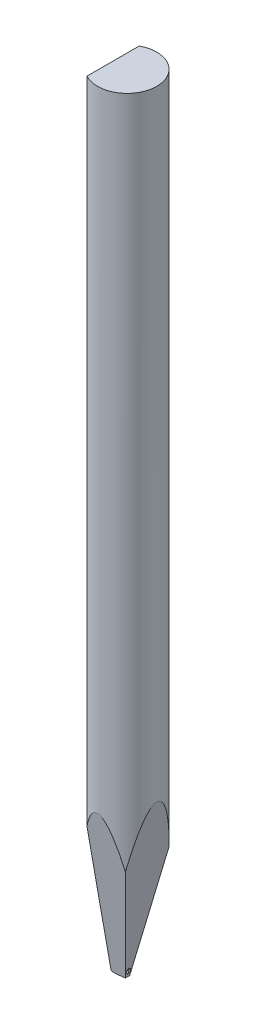
ISO-10303-21;
HEADER;
FILE_DESCRIPTION(('STEP AP214'),'2;1');
FILE_NAME('part.step','',(''),(''),'','','');
FILE_SCHEMA(('AUTOMOTIVE_DESIGN { 1 0 10303 214 1 1 1 1 }'));
ENDSEC;
DATA;
#1=APPLICATION_CONTEXT('core data for automotive mechanical design processes');
#2=APPLICATION_PROTOCOL_DEFINITION('international standard','automotive_design',2000,#1);
#3=PRODUCT_CONTEXT('',#1,'mechanical');
#4=PRODUCT('Part','Part','',(#3));
#5=PRODUCT_RELATED_PRODUCT_CATEGORY('part','',(#4));
#6=PRODUCT_DEFINITION_FORMATION('','',#4);
#7=PRODUCT_DEFINITION_CONTEXT('part definition',#1,'design');
#8=PRODUCT_DEFINITION('design','',#6,#7);
#9=PRODUCT_DEFINITION_SHAPE('','',#8);
#10=(LENGTH_UNIT() NAMED_UNIT(*) SI_UNIT(.MILLI.,.METRE.));
#11=(NAMED_UNIT(*) PLANE_ANGLE_UNIT() SI_UNIT($,.RADIAN.));
#12=(NAMED_UNIT(*) SI_UNIT($,.STERADIAN.) SOLID_ANGLE_UNIT());
#13=UNCERTAINTY_MEASURE_WITH_UNIT(LENGTH_MEASURE(1.E-05),#10,'distance_accuracy_value','');
#14=(GEOMETRIC_REPRESENTATION_CONTEXT(3) GLOBAL_UNCERTAINTY_ASSIGNED_CONTEXT((#13)) GLOBAL_UNIT_ASSIGNED_CONTEXT((#10,
#11,#12)) REPRESENTATION_CONTEXT('',''));
#15=CARTESIAN_POINT('',(0.,0.,0.));
#16=DIRECTION('',(0.,0.,1.));
#17=DIRECTION('',(1.,0.,0.));
#18=AXIS2_PLACEMENT_3D('',#15,#16,#17);
#19=CARTESIAN_POINT('',(26.8738719491216,0.,0.0508));
#20=DIRECTION('',(0.,-0.173648177666931,0.984807753012208));
#21=DIRECTION('',(0.,-0.984807753012208,-0.173648177666931));
#22=AXIS2_PLACEMENT_3D('',#19,#20,#21);
#23=PLANE('',#22);
#24=CARTESIAN_POINT('',(-0.34798,0.02794,0.0557265758409954));
#25=DIRECTION('',(0.,-0.173648177666931,0.984807753012208));
#26=DIRECTION('',(0.,-0.984807753012208,-0.173648177666931));
#27=AXIS2_PLACEMENT_3D('',#24,#25,#26);
#28=ELLIPSE('',#27,0.0283710195360877,0.02794);
#29=CARTESIAN_POINT('',(-0.34798,0.,0.0508000000000009));
#30=VERTEX_POINT('',#29);
#31=CARTESIAN_POINT('',(-0.37592,0.02794,0.0557265758409954));
#32=VERTEX_POINT('',#31);
#33=EDGE_CURVE('E216',#30,#32,#28,.F.);
#34=ORIENTED_EDGE('',*,*,#33,.F.);
#35=DIRECTION('',(-1.,0.,0.));
#36=VECTOR('',#35,1.);
#37=CARTESIAN_POINT('',(26.8738719491216,0.,0.0508));
#38=LINE('',#37,#36);
#39=CARTESIAN_POINT('',(-0.236219999999995,0.,0.0508));
#40=VERTEX_POINT('',#39);
#41=EDGE_CURVE('E287',#40,#30,#38,.T.);
#42=ORIENTED_EDGE('',*,*,#41,.F.);
#43=DIRECTION('',(-0.98997002855162,-0.139131214142995,-0.0245325869121374));
#44=VECTOR('',#43,1.);
#45=CARTESIAN_POINT('',(26.3327723368183,3.73402836021789,0.709209946637006));
#46=LINE('',#45,#44);
#47=CARTESIAN_POINT('',(0.0112116383295108,0.0347742489826093,0.0569316383295079));
#48=VERTEX_POINT('',#47);
#49=EDGE_CURVE('E284',#48,#40,#46,.T.);
#50=ORIENTED_EDGE('',*,*,#49,.F.);
#51=DIRECTION('',(-0.171087869746036,-0.970287525247814,-0.171087869746036));
#52=VECTOR('',#51,1.);
#53=CARTESIAN_POINT('',(0.791557999082992,4.46033837772866,0.837277999082991));
#54=LINE('',#53,#52);
#55=CARTESIAN_POINT('',(0.537041505266774,3.0169036135559,0.582761505266773));
#56=VERTEX_POINT('',#55);
#57=EDGE_CURVE('E281',#56,#48,#54,.T.);
#58=ORIENTED_EDGE('',*,*,#57,.F.);
#59=CARTESIAN_POINT('',(0.,-0.288101116436578,0.));
#60=DIRECTION('',(0.,-0.173648177666931,0.984807753012208));
#61=DIRECTION('',(0.,-0.984807753012208,-0.173648177666931));
#62=AXIS2_PLACEMENT_3D('',#59,#60,#61);
#63=ELLIPSE('',#62,4.56371043248163,0.792479999999998);
#64=CARTESIAN_POINT('',(-0.37592,3.66844093071415,0.69764511322018));
#65=VERTEX_POINT('',#64);
#66=EDGE_CURVE('E292',#56,#65,#63,.T.);
#67=ORIENTED_EDGE('',*,*,#66,.T.);
#68=DIRECTION('',(0.,0.984807753012208,0.173648177666931));
#69=VECTOR('',#68,1.);
#70=CARTESIAN_POINT('',(-0.37592,20.251112252608,3.62161747949059));
#71=LINE('',#70,#69);
#72=EDGE_CURVE('E306',#32,#65,#71,.T.);
#73=ORIENTED_EDGE('',*,*,#72,.F.);
#74=EDGE_LOOP('',(#34,#42,#50,#58,#67,#73));
#75=FACE_BOUND('',#74,.T.);
#76=ADVANCED_FACE('F46',(#75),#23,.T.);
#77=CARTESIAN_POINT('',(26.8738719491216,0.,-0.0508));
#78=DIRECTION('',(0.,-0.173648177666931,-0.984807753012208));
#79=DIRECTION('',(0.,0.984807753012208,-0.173648177666931));
#80=AXIS2_PLACEMENT_3D('',#77,#78,#79);
#81=PLANE('',#80);
#82=CARTESIAN_POINT('',(-0.34798,0.02794,-0.0557265758409919));
#83=DIRECTION('',(0.,-0.173648177666931,-0.984807753012208));
#84=DIRECTION('',(0.,0.984807753012208,-0.173648177666931));
#85=AXIS2_PLACEMENT_3D('',#82,#83,#84);
#86=ELLIPSE('',#85,0.0283710195360877,0.02794);
#87=CARTESIAN_POINT('',(-0.37592,0.02794,-0.0557265758409919));
#88=VERTEX_POINT('',#87);
#89=CARTESIAN_POINT('',(-0.34798,0.,-0.0507999999999974));
#90=VERTEX_POINT('',#89);
#91=EDGE_CURVE('E213',#88,#90,#86,.F.);
#92=ORIENTED_EDGE('',*,*,#91,.F.);
#93=DIRECTION('',(0.,-0.984807753012208,0.173648177666931));
#94=VECTOR('',#93,1.);
#95=CARTESIAN_POINT('',(-0.37592,20.5255765703836,-3.67001294395617));
#96=LINE('',#95,#94);
#97=CARTESIAN_POINT('',(-0.37592,3.66844093071414,-0.69764511322018));
#98=VERTEX_POINT('',#97);
#99=EDGE_CURVE('E205',#98,#88,#96,.T.);
#100=ORIENTED_EDGE('',*,*,#99,.F.);
#101=CARTESIAN_POINT('',(0.,-0.288101116436578,0.));
#102=DIRECTION('',(0.,-0.173648177666931,-0.984807753012208));
#103=DIRECTION('',(0.,-0.984807753012208,0.173648177666931));
#104=AXIS2_PLACEMENT_3D('',#101,#102,#103);
#105=ELLIPSE('',#104,4.56371043248163,0.792479999999998);
#106=CARTESIAN_POINT('',(0.537041505266774,3.0169036135559,-0.582761505266773));
#107=VERTEX_POINT('',#106);
#108=EDGE_CURVE('E295',#98,#107,#105,.T.);
#109=ORIENTED_EDGE('',*,*,#108,.T.);
#110=DIRECTION('',(0.171087869746036,0.970287525247814,-0.171087869746036));
#111=VECTOR('',#110,1.);
#112=CARTESIAN_POINT('',(0.791557999082992,4.46033837772866,-0.837277999082991));
#113=LINE('',#112,#111);
#114=CARTESIAN_POINT('',(0.0112116383295108,0.0347742489826093,-0.0569316383295079));
#115=VERTEX_POINT('',#114);
#116=EDGE_CURVE('E309',#115,#107,#113,.T.);
#117=ORIENTED_EDGE('',*,*,#116,.F.);
#118=DIRECTION('',(0.98997002855162,0.139131214142995,-0.0245325869121374));
#119=VECTOR('',#118,1.);
#120=CARTESIAN_POINT('',(26.3327723368183,3.73402836021789,-0.709209946637006));
#121=LINE('',#120,#119);
#122=CARTESIAN_POINT('',(-0.236219999999995,0.,-0.0508));
#123=VERTEX_POINT('',#122);
#124=EDGE_CURVE('E312',#123,#115,#121,.T.);
#125=ORIENTED_EDGE('',*,*,#124,.F.);
#126=DIRECTION('',(-1.,0.,0.));
#127=VECTOR('',#126,1.);
#128=CARTESIAN_POINT('',(26.8738719491216,0.,-0.0508));
#129=LINE('',#128,#127);
#130=EDGE_CURVE('E289',#123,#90,#129,.T.);
#131=ORIENTED_EDGE('',*,*,#130,.T.);
#132=EDGE_LOOP('',(#92,#100,#109,#117,#125,#131));
#133=FACE_BOUND('',#132,.T.);
#134=ADVANCED_FACE('F401',(#133),#81,.T.);
#135=CARTESIAN_POINT('',(-0.23622,0.,27.2760283406468));
#136=DIRECTION('',(-0.139173100960066,0.99026806874157,0.));
#137=DIRECTION('',(-0.99026806874157,-0.139173100960066,0.));
#138=AXIS2_PLACEMENT_3D('',#135,#136,#137);
#139=PLANE('',#138);
#140=DIRECTION('',(-0.99026806874157,-0.139173100960066,0.));
#141=VECTOR('',#140,1.);
#142=CARTESIAN_POINT('',(-0.23622,0.,0.0304799999999994));
#143=LINE('',#142,#141);
#144=CARTESIAN_POINT('',(-0.10414,0.0185626334474919,0.0304799999999997));
#145=VERTEX_POINT('',#144);
#146=CARTESIAN_POINT('',(-0.219891220242702,0.00229486033676197,0.03048));
#147=VERTEX_POINT('',#146);
#148=EDGE_CURVE('E267',#145,#147,#143,.T.);
#149=ORIENTED_EDGE('',*,*,#148,.F.);
#150=DIRECTION('',(0.,0.,1.));
#151=VECTOR('',#150,1.);
#152=CARTESIAN_POINT('',(-0.10414,0.0185626334474919,27.2760283406468));
#153=LINE('',#152,#151);
#154=CARTESIAN_POINT('',(-0.10414,0.0185626334474919,-0.0304799999999997));
#155=VERTEX_POINT('',#154);
#156=EDGE_CURVE('E323',#155,#145,#153,.T.);
#157=ORIENTED_EDGE('',*,*,#156,.F.);
#158=DIRECTION('',(-0.99026806874157,-0.139173100960066,0.));
#159=VECTOR('',#158,1.);
#160=CARTESIAN_POINT('',(-0.23622,0.,-0.0304799999999994));
#161=LINE('',#160,#159);
#162=CARTESIAN_POINT('',(-0.219891220242702,0.00229486033676197,-0.03048));
#163=VERTEX_POINT('',#162);
#164=EDGE_CURVE('E263',#155,#163,#161,.T.);
#165=ORIENTED_EDGE('',*,*,#164,.T.);
#166=CARTESIAN_POINT('',(-2.39594817183527,-0.30353,0.));
#167=DIRECTION('',(-0.139173100960066,0.99026806874157,0.));
#168=DIRECTION('',(-0.99026806874157,-0.139173100960066,0.));
#169=AXIS2_PLACEMENT_3D('',#166,#167,#168);
#170=ELLIPSE('',#169,2.20832903686027,0.30734);
#171=CARTESIAN_POINT('',(-0.23622,0.,-0.0482432865795759));
#172=VERTEX_POINT('',#171);
#173=EDGE_CURVE('E315',#163,#172,#170,.T.);
#174=ORIENTED_EDGE('',*,*,#173,.T.);
#175=DIRECTION('',(0.,0.,-1.));
#176=VECTOR('',#175,1.);
#177=CARTESIAN_POINT('',(-0.23622,0.,27.2760283406468));
#178=LINE('',#177,#176);
#179=EDGE_CURVE('E273',#172,#123,#178,.T.);
#180=ORIENTED_EDGE('',*,*,#179,.T.);
#181=ORIENTED_EDGE('',*,*,#124,.T.);
#182=DIRECTION('',(0.,0.,-1.));
#183=VECTOR('',#182,1.);
#184=CARTESIAN_POINT('',(0.0112116383295079,0.0347742489826094,27.2760283406468));
#185=LINE('',#184,#183);
#186=EDGE_CURVE('E270',#48,#115,#185,.T.);
#187=ORIENTED_EDGE('',*,*,#186,.F.);
#188=ORIENTED_EDGE('',*,*,#49,.T.);
#189=CARTESIAN_POINT('',(-0.236219999999999,0.,0.0482432865795852));
#190=VERTEX_POINT('',#189);
#191=EDGE_CURVE('E275',#40,#190,#178,.T.);
#192=ORIENTED_EDGE('',*,*,#191,.T.);
#193=EDGE_CURVE('E316',#190,#147,#170,.T.);
#194=ORIENTED_EDGE('',*,*,#193,.T.);
#195=EDGE_LOOP('',(#149,#157,#165,#174,#180,#181,#187,#188,#192,#194));
#196=FACE_BOUND('',#195,.T.);
#197=ADVANCED_FACE('F348',(#196),#139,.F.);
#198=CARTESIAN_POINT('',(26.6992469491216,-0.30353,0.));
#199=DIRECTION('',(-1.,0.,0.));
#200=DIRECTION('',(0.,0.,1.));
#201=AXIS2_PLACEMENT_3D('',#198,#199,#200);
#202=CYLINDRICAL_SURFACE('',#201,0.30734);
#203=DIRECTION('',(-1.,0.,0.));
#204=VECTOR('',#203,1.);
#205=CARTESIAN_POINT('',(26.6992469491216,0.,0.0482432865795852));
#206=LINE('',#205,#204);
#207=CARTESIAN_POINT('',(-0.347980000000001,0.,0.0482432865795858));
#208=VERTEX_POINT('',#207);
#209=EDGE_CURVE('E322',#190,#208,#206,.T.);
#210=ORIENTED_EDGE('',*,*,#209,.T.);
#211=CARTESIAN_POINT('',(-0.34798,0.,0.0482432865795852));
#212=CARTESIAN_POINT('',(-0.348252296644925,-1.31195659384749E-07,0.0482440492475039));
#213=CARTESIAN_POINT('',(-0.348523545505448,3.97529791394988E-06,0.0482182784555705));
#214=CARTESIAN_POINT('',(-0.349054083948038,1.94428443583289E-05,0.0481208402416169));
#215=CARTESIAN_POINT('',(-0.349313481002626,3.07120542223338E-05,0.0480497538396694));
#216=CARTESIAN_POINT('',(-0.349886743277128,6.32629122701802E-05,0.0478436938858755));
#217=CARTESIAN_POINT('',(-0.350196039020314,8.64427631084383E-05,0.0476965466679436));
#218=CARTESIAN_POINT('',(-0.350788027579429,0.000139867694047395,0.0473552263029247));
#219=CARTESIAN_POINT('',(-0.351070565232969,0.000170150815958249,0.0471607997362597));
#220=CARTESIAN_POINT('',(-0.351797678633356,0.000258175405523862,0.0465912997969798));
#221=CARTESIAN_POINT('',(-0.352217043441584,0.000320286556949055,0.0461851188543542));
#222=CARTESIAN_POINT('',(-0.352993403074285,0.000450697484912939,0.045318964518081));
#223=CARTESIAN_POINT('',(-0.353350255395906,0.0005190108757752,0.0448588721094139));
#224=CARTESIAN_POINT('',(-0.354623695048138,0.000783914898953172,0.0430431737934963));
#225=CARTESIAN_POINT('',(-0.355379822665012,0.00098815447895486,0.0415787296435384));
#226=CARTESIAN_POINT('',(-0.356692318863868,0.0013850917833933,0.038562532067988));
#227=CARTESIAN_POINT('',(-0.357247387378443,0.00157770790674325,0.0370102829147653));
#228=CARTESIAN_POINT('',(-0.359321149792044,0.0023456206793924,0.0303893376374603));
#229=CARTESIAN_POINT('',(-0.360257770424908,0.00282567245131376,0.0251321497342822));
#230=CARTESIAN_POINT('',(-0.361551936903057,0.00351278341625745,0.014539520375778));
#231=CARTESIAN_POINT('',(-0.361907066355234,0.00371870279026332,0.00920384488122757));
#232=CARTESIAN_POINT('',(-0.362154217543677,0.0038612004814519,-0.00215201122800966));
#233=CARTESIAN_POINT('',(-0.361982628750261,0.00376079301183627,-0.00817418080146167));
#234=CARTESIAN_POINT('',(-0.360999130647652,0.00320709071523554,-0.0201325235406135));
#235=CARTESIAN_POINT('',(-0.360191991906012,0.00275642532114498,-0.0260690031870829));
#236=CARTESIAN_POINT('',(-0.358232095740427,0.001944655358155,-0.0338747550375601));
#237=CARTESIAN_POINT('',(-0.357637288229639,0.00171300123613475,-0.0358996292027306));
#238=CARTESIAN_POINT('',(-0.356122323252021,0.00119745877491824,-0.0400446770350524));
#239=CARTESIAN_POINT('',(-0.355178593442109,0.000910792082540283,-0.0421580801913151));
#240=CARTESIAN_POINT('',(-0.353655530246412,0.000581526564032731,-0.0444320817022823));
#241=CARTESIAN_POINT('',(-0.353393651448074,0.000528075963328786,-0.0447961119259361));
#242=CARTESIAN_POINT('',(-0.352835779504986,0.000423669016665647,-0.045499072621403));
#243=CARTESIAN_POINT('',(-0.352539718401944,0.00037271793670273,-0.0458379508131751));
#244=CARTESIAN_POINT('',(-0.351903397718423,0.000274943891731922,-0.0464816039815951));
#245=CARTESIAN_POINT('',(-0.351562622422041,0.000228181889394723,-0.0467858886873818));
#246=CARTESIAN_POINT('',(-0.350832796873585,0.000143622369928017,-0.0473316207810331));
#247=CARTESIAN_POINT('',(-0.350443957507317,0.000105787671713089,-0.0475733292155792));
#248=CARTESIAN_POINT('',(-0.34978718459901,5.74282979152137E-05,-0.0478807134545133));
#249=CARTESIAN_POINT('',(-0.349534511485235,4.20567642306474E-05,-0.0479779895919411));
#250=CARTESIAN_POINT('',(-0.349016605835852,1.80496782489349E-05,-0.0481296519413833));
#251=CARTESIAN_POINT('',(-0.348751411991796,9.39465253077176E-06,-0.0481841621513262));
#252=CARTESIAN_POINT('',(-0.348316427274345,1.50783539036545E-06,-0.048233796094123));
#253=CARTESIAN_POINT('',(-0.348148240178769,-4.30094660196576E-08,-0.0482435397422961));
#254=CARTESIAN_POINT('',(-0.34798,0.,-0.0482432865795859));
#255=B_SPLINE_CURVE_WITH_KNOTS('',3,(#211,#212,#213,#214,#215,#216,#217,#218,#219,#220,#221,
#222,#223,#224,#225,#226,#227,#228,#229,#230,#231,#232,#233,#234,#235,#236,#237,#238,#239,#240,
#241,#242,#243,#244,#245,#246,#247,#248,#249,#250,#251,#252,#253,#254),.UNSPECIFIED.,.F.,.F.,(4,
2,2,2,2,2,2,2,2,2,2,2,2,2,2,2,2,2,2,2,2,4),(0.,0.000813951897065788,0.00161767193750738,
0.00264178770559886,0.00367151870355399,0.00542291670139487,0.00717825663544555,
0.0121215106148599,0.0170961804313095,0.0330671249043096,0.0491042699221511,0.0671510890543338,
0.0850637216864271,0.0914325778752907,0.0983489113876423,0.0997021906160121,0.101058208212651,
0.102431526643176,0.103799020226141,0.104609536963543,0.10541769486763,0.105922115585613),.UNSPECIFIED.);
#256=CARTESIAN_POINT('',(-0.359869384762639,0.00266441680316907,0.0265067437956558));
#257=VERTEX_POINT('',#256);
#258=EDGE_CURVE('E214',#208,#257,#255,.T.);
#259=ORIENTED_EDGE('',*,*,#258,.T.);
#260=CARTESIAN_POINT('',(-0.37592,0.,-0.0482432865795854));
#261=CARTESIAN_POINT('',(-0.363217772431748,0.00253447256157342,-0.0322972656685655));
#262=CARTESIAN_POINT('',(-0.35052,0.00380999999999999,-0.0161478491107738));
#263=CARTESIAN_POINT('',(-0.35052,0.00380999999999997,0.0161478491107741));
#264=CARTESIAN_POINT('',(-0.363217772431748,0.00253447256157349,0.0322972656685651));
#265=CARTESIAN_POINT('',(-0.37592,0.,0.0482432865795852));
#266=(BOUNDED_CURVE() B_SPLINE_CURVE(3,(#260,#261,#262,#263,#264,#265),.UNSPECIFIED.,.F.,
.F.) B_SPLINE_CURVE_WITH_KNOTS((4,2,4),(1.41317404265068,1.5707963267949,1.72841861093912),
.UNSPECIFIED.) CURVE() GEOMETRIC_REPRESENTATION_ITEM() RATIONAL_B_SPLINE_CURVE((1.,1.,1.,1.,1.,1.)) REPRESENTATION_ITEM(''));
#267=CARTESIAN_POINT('',(-0.359869345133111,0.00266441457640248,-0.026506769547461));
#268=VERTEX_POINT('',#267);
#269=EDGE_CURVE('E197',#257,#268,#266,.F.);
#270=ORIENTED_EDGE('',*,*,#269,.T.);
#271=CARTESIAN_POINT('',(-0.347980000000001,0.,-0.0482432865795858));
#272=VERTEX_POINT('',#271);
#273=EDGE_CURVE('E79',#268,#272,#255,.T.);
#274=ORIENTED_EDGE('',*,*,#273,.T.);
#275=DIRECTION('',(-1.,0.,0.));
#276=VECTOR('',#275,1.);
#277=CARTESIAN_POINT('',(26.6992469491216,0.,-0.0482432865795852));
#278=LINE('',#277,#276);
#279=EDGE_CURVE('E274',#172,#272,#278,.T.);
#280=ORIENTED_EDGE('',*,*,#279,.F.);
#281=ORIENTED_EDGE('',*,*,#173,.F.);
#282=DIRECTION('',(-1.,0.,0.));
#283=VECTOR('',#282,1.);
#284=CARTESIAN_POINT('',(26.6992469491216,0.00229486033676197,-0.03048));
#285=LINE('',#284,#283);
#286=CARTESIAN_POINT('',(-0.250499789357019,0.00229486033676168,-0.03048));
#287=VERTEX_POINT('',#286);
#288=EDGE_CURVE('E319',#163,#287,#285,.T.);
#289=ORIENTED_EDGE('',*,*,#288,.T.);
#290=CARTESIAN_POINT('',(-0.250499789357019,0.002294860336762,0.03048));
#291=CARTESIAN_POINT('',(-0.259076938263125,0.00172519583332262,0.0361957994489226));
#292=CARTESIAN_POINT('',(-0.271209651741863,0.00171565237775058,0.0362982767150302));
#293=CARTESIAN_POINT('',(-0.291802330840911,0.00288099375836612,0.0245921957541284));
#294=CARTESIAN_POINT('',(-0.299524052155455,0.00381566011554372,0.0124973879925436));
#295=CARTESIAN_POINT('',(-0.299445507311918,0.00380427753482841,-0.0127742455996653));
#296=CARTESIAN_POINT('',(-0.291682746457828,0.00286585524756007,-0.0247675498216622));
#297=CARTESIAN_POINT('',(-0.271072903155547,0.00170638974053564,-0.0363675406814372));
#298=CARTESIAN_POINT('',(-0.259039156501342,0.00172700889941999,-0.036177607825366));
#299=CARTESIAN_POINT('',(-0.250499789357018,0.00229486033676202,-0.03048));
#300=(BOUNDED_CURVE() B_SPLINE_CURVE(3,(#290,#291,#292,#293,#294,#295,#296,#297,#298,#299),
.UNSPECIFIED.,.F.,.F.) B_SPLINE_CURVE_WITH_KNOTS((4,2,2,2,4),(0.,2.5360657926676E-05,
5.07213158533513E-05,7.60819737800265E-05,0.000101442631706702),
.UNSPECIFIED.) CURVE() GEOMETRIC_REPRESENTATION_ITEM() RATIONAL_B_SPLINE_CURVE((1.,1.,1.,1.,1.,
1.,1.,1.,1.,1.)) REPRESENTATION_ITEM(''));
#301=CARTESIAN_POINT('',(-0.250499789357018,0.00229486033676188,0.03048));
#302=VERTEX_POINT('',#301);
#303=EDGE_CURVE('E325',#287,#302,#300,.F.);
#304=ORIENTED_EDGE('',*,*,#303,.T.);
#305=DIRECTION('',(-1.,0.,0.));
#306=VECTOR('',#305,1.);
#307=CARTESIAN_POINT('',(26.6992469491216,0.00229486033676197,0.03048));
#308=LINE('',#307,#306);
#309=EDGE_CURVE('E326',#147,#302,#308,.T.);
#310=ORIENTED_EDGE('',*,*,#309,.F.);
#311=ORIENTED_EDGE('',*,*,#193,.F.);
#312=EDGE_LOOP('',(#210,#259,#270,#274,#280,#281,#289,#304,#310,#311));
#313=FACE_BOUND('',#312,.T.);
#314=ADVANCED_FACE('F337',(#313),#202,.F.);
#315=CARTESIAN_POINT('',(0.,0.,0.));
#316=DIRECTION('',(0.,1.,0.));
#317=DIRECTION('',(0.,0.,1.));
#318=AXIS2_PLACEMENT_3D('',#315,#316,#317);
#319=PLANE('',#318);
#320=ORIENTED_EDGE('',*,*,#41,.T.);
#321=DIRECTION('',(0.,0.,-1.));
#322=VECTOR('',#321,1.);
#323=CARTESIAN_POINT('',(-0.34798,0.,26.4486411070088));
#324=LINE('',#323,#322);
#325=EDGE_CURVE('E71',#30,#208,#324,.T.);
#326=ORIENTED_EDGE('',*,*,#325,.T.);
#327=ORIENTED_EDGE('',*,*,#209,.F.);
#328=ORIENTED_EDGE('',*,*,#191,.F.);
#329=EDGE_LOOP('',(#320,#326,#327,#328));
#330=FACE_BOUND('',#329,.T.);
#331=ADVANCED_FACE('F347',(#330),#319,.F.);
#332=ORIENTED_EDGE('',*,*,#279,.T.);
#333=EDGE_CURVE('E212',#272,#90,#324,.T.);
#334=ORIENTED_EDGE('',*,*,#333,.T.);
#335=ORIENTED_EDGE('',*,*,#130,.F.);
#336=ORIENTED_EDGE('',*,*,#179,.F.);
#337=EDGE_LOOP('',(#332,#334,#335,#336));
#338=FACE_BOUND('',#337,.T.);
#339=ADVANCED_FACE('F406',(#338),#319,.F.);
#340=CARTESIAN_POINT('',(0.,21.0312,0.));
#341=DIRECTION('',(0.,-1.,0.));
#342=DIRECTION('',(0.,0.,-1.));
#343=AXIS2_PLACEMENT_3D('',#340,#341,#342);
#344=CYLINDRICAL_SURFACE('',#343,0.792479999999998);
#345=ORIENTED_EDGE('',*,*,#66,.F.);
#346=CARTESIAN_POINT('',(0.,-0.0288101116436568,0.));
#347=DIRECTION('',(-0.984807753012208,0.173648177666931,0.));
#348=DIRECTION('',(-0.173648177666931,-0.984807753012208,0.));
#349=AXIS2_PLACEMENT_3D('',#346,#347,#348);
#350=ELLIPSE('',#349,4.56371043248164,0.792479999999998);
#351=EDGE_CURVE('E278',#56,#107,#350,.T.);
#352=ORIENTED_EDGE('',*,*,#351,.T.);
#353=ORIENTED_EDGE('',*,*,#108,.F.);
#354=DIRECTION('',(0.,-1.,0.));
#355=VECTOR('',#354,1.);
#356=CARTESIAN_POINT('',(-0.37592,21.0312,-0.69764511322018));
#357=LINE('',#356,#355);
#358=CARTESIAN_POINT('',(-0.37592,21.0312,-0.69764511322018));
#359=VERTEX_POINT('',#358);
#360=EDGE_CURVE('E301',#359,#98,#357,.T.);
#361=ORIENTED_EDGE('',*,*,#360,.F.);
#362=CARTESIAN_POINT('',(0.,21.0312,0.));
#363=DIRECTION('',(0.,1.,0.));
#364=DIRECTION('',(0.,0.,1.));
#365=AXIS2_PLACEMENT_3D('',#362,#363,#364);
#366=CIRCLE('',#365,0.792479999999998);
#367=CARTESIAN_POINT('',(-0.37592,21.0312,0.69764511322018));
#368=VERTEX_POINT('',#367);
#369=EDGE_CURVE('E303',#368,#359,#366,.T.);
#370=ORIENTED_EDGE('',*,*,#369,.F.);
#371=DIRECTION('',(0.,-1.,0.));
#372=VECTOR('',#371,1.);
#373=CARTESIAN_POINT('',(-0.37592,21.0312,0.69764511322018));
#374=LINE('',#373,#372);
#375=EDGE_CURVE('E299',#65,#368,#374,.F.);
#376=ORIENTED_EDGE('',*,*,#375,.F.);
#377=EDGE_LOOP('',(#345,#352,#353,#361,#370,#376));
#378=FACE_BOUND('',#377,.T.);
#379=ADVANCED_FACE('F400',(#378),#344,.T.);
#380=CARTESIAN_POINT('',(-0.37592,21.0312,-0.80247998));
#381=DIRECTION('',(-1.,0.,0.));
#382=DIRECTION('',(0.,0.,1.));
#383=AXIS2_PLACEMENT_3D('',#380,#381,#382);
#384=PLANE('',#383);
#385=DIRECTION('',(0.,0.,-1.));
#386=VECTOR('',#385,1.);
#387=CARTESIAN_POINT('',(-0.37592,0.02794,26.4486411070088));
#388=LINE('',#387,#386);
#389=CARTESIAN_POINT('',(-0.37592,0.0279399277622946,0.00933532986884245));
#390=VERTEX_POINT('',#389);
#391=EDGE_CURVE('E208',#32,#390,#388,.T.);
#392=ORIENTED_EDGE('',*,*,#391,.F.);
#393=ORIENTED_EDGE('',*,*,#72,.T.);
#394=ORIENTED_EDGE('',*,*,#375,.T.);
#395=DIRECTION('',(0.,0.,-1.));
#396=VECTOR('',#395,1.);
#397=CARTESIAN_POINT('',(-0.37592,21.0312,-0.80247998));
#398=LINE('',#397,#396);
#399=EDGE_CURVE('E297',#368,#359,#398,.T.);
#400=ORIENTED_EDGE('',*,*,#399,.T.);
#401=ORIENTED_EDGE('',*,*,#360,.T.);
#402=ORIENTED_EDGE('',*,*,#99,.T.);
#403=CARTESIAN_POINT('',(-0.37592,0.02794,-0.0089996161780348));
#404=VERTEX_POINT('',#403);
#405=EDGE_CURVE('E202',#404,#88,#388,.T.);
#406=ORIENTED_EDGE('',*,*,#405,.F.);
#407=CARTESIAN_POINT('',(-0.37592,0.,0.0482432865795852));
#408=CARTESIAN_POINT('',(-0.37592,0.0149574693246277,0.0344039161936227));
#409=CARTESIAN_POINT('',(-0.37592,0.0292099999999983,0.0174815349681417));
#410=CARTESIAN_POINT('',(-0.37592,0.0292099999999983,-0.0174815349681413));
#411=CARTESIAN_POINT('',(-0.37592,0.0149574693246281,-0.0344039161936234));
#412=CARTESIAN_POINT('',(-0.37592,0.,-0.0482432865795854));
#413=(BOUNDED_CURVE() B_SPLINE_CURVE(3,(#407,#408,#409,#410,#411,#412),.UNSPECIFIED.,.F.,
.F.) B_SPLINE_CURVE_WITH_KNOTS((4,2,4),(1.41317404265068,1.5707963267949,1.72841861093912),
.UNSPECIFIED.) CURVE() GEOMETRIC_REPRESENTATION_ITEM() RATIONAL_B_SPLINE_CURVE((1.,1.,1.,1.,1.,1.)) REPRESENTATION_ITEM(''));
#414=EDGE_CURVE('E190',#404,#390,#413,.F.);
#415=ORIENTED_EDGE('',*,*,#414,.T.);
#416=EDGE_LOOP('',(#392,#393,#394,#400,#401,#402,#406,#415));
#417=FACE_BOUND('',#416,.T.);
#418=ADVANCED_FACE('F203',(#417),#384,.T.);
#419=CARTESIAN_POINT('',(0.,21.0312,0.));
#420=DIRECTION('',(0.,1.,0.));
#421=DIRECTION('',(0.,0.,1.));
#422=AXIS2_PLACEMENT_3D('',#419,#420,#421);
#423=PLANE('',#422);
#424=ORIENTED_EDGE('',*,*,#369,.T.);
#425=ORIENTED_EDGE('',*,*,#399,.F.);
#426=EDGE_LOOP('',(#424,#425));
#427=FACE_BOUND('',#426,.T.);
#428=ADVANCED_FACE('F399',(#427),#423,.T.);
#429=CARTESIAN_POINT('',(0.0112116383295079,0.0347742489826094,27.2760283406468));
#430=DIRECTION('',(-0.984807753012208,0.173648177666931,0.));
#431=DIRECTION('',(-0.173648177666931,-0.984807753012208,0.));
#432=AXIS2_PLACEMENT_3D('',#429,#430,#431);
#433=PLANE('',#432);
#434=CARTESIAN_POINT('',(0.0366042790441627,0.178783070619715,0.));
#435=DIRECTION('',(-0.984807753012208,0.173648177666931,0.));
#436=DIRECTION('',(0.173648177666931,0.984807753012208,0.));
#437=AXIS2_PLACEMENT_3D('',#434,#435,#436);
#438=ELLIPSE('',#437,0.0693607973593453,0.0498208670946964);
#439=CARTESIAN_POINT('',(0.0486486551071383,0.247090121614307,0.));
#440=VERTEX_POINT('',#439);
#441=EDGE_CURVE('E269',#440,#440,#438,.F.);
#442=ORIENTED_EDGE('',*,*,#441,.F.);
#443=EDGE_LOOP('',(#442));
#444=FACE_BOUND('',#443,.T.);
#445=ORIENTED_EDGE('',*,*,#351,.F.);
#446=ORIENTED_EDGE('',*,*,#57,.T.);
#447=ORIENTED_EDGE('',*,*,#186,.T.);
#448=ORIENTED_EDGE('',*,*,#116,.T.);
#449=EDGE_LOOP('',(#445,#446,#447,#448));
#450=FACE_BOUND('',#449,.T.);
#451=ADVANCED_FACE('F353',(#444,#450),#433,.F.);
#452=CARTESIAN_POINT('',(-0.10414,0.0762000000000001,0.03048));
#453=DIRECTION('',(-1.,0.,0.));
#454=DIRECTION('',(0.,0.,1.));
#455=AXIS2_PLACEMENT_3D('',#452,#453,#454);
#456=PLANE('',#455);
#457=ORIENTED_EDGE('',*,*,#156,.T.);
#458=DIRECTION('',(0.,1.,0.));
#459=VECTOR('',#458,1.);
#460=CARTESIAN_POINT('',(-0.10414,0.0762000000000001,0.03048));
#461=LINE('',#460,#459);
#462=CARTESIAN_POINT('',(-0.10414,0.0659347122138084,0.03048));
#463=VERTEX_POINT('',#462);
#464=EDGE_CURVE('E251',#145,#463,#461,.T.);
#465=ORIENTED_EDGE('',*,*,#464,.T.);
#466=CARTESIAN_POINT('',(-0.10414,0.0762000000000001,0.));
#467=DIRECTION('',(1.,0.,0.));
#468=DIRECTION('',(0.,1.,0.));
#469=AXIS2_PLACEMENT_3D('',#466,#467,#468);
#470=ELLIPSE('',#469,0.0366617420935411,0.03175);
#471=CARTESIAN_POINT('',(-0.10414,0.0659347122138084,-0.03048));
#472=VERTEX_POINT('',#471);
#473=EDGE_CURVE('E247',#472,#463,#470,.F.);
#474=ORIENTED_EDGE('',*,*,#473,.F.);
#475=DIRECTION('',(0.,1.,0.));
#476=VECTOR('',#475,1.);
#477=CARTESIAN_POINT('',(-0.10414,0.0762000000000001,-0.03048));
#478=LINE('',#477,#476);
#479=EDGE_CURVE('E259',#155,#472,#478,.T.);
#480=ORIENTED_EDGE('',*,*,#479,.F.);
#481=EDGE_LOOP('',(#457,#465,#474,#480));
#482=FACE_BOUND('',#481,.T.);
#483=ADVANCED_FACE('F514',(#482),#456,.T.);
#484=CARTESIAN_POINT('',(0.00113009313751881,0.136977716610563,0.));
#485=DIRECTION('',(0.866025403784441,0.499999999999995,0.));
#486=DIRECTION('',(-0.499999999999995,0.866025403784441,0.));
#487=AXIS2_PLACEMENT_3D('',#484,#485,#486);
#488=CONICAL_SURFACE('',#487,0.03175,0.392699081698725);
#489=CARTESIAN_POINT('',(0.00113009313751881,0.136977716610563,0.));
#490=DIRECTION('',(0.866025403784441,0.499999999999995,0.));
#491=DIRECTION('',(-0.499999999999995,0.866025403784441,0.));
#492=AXIS2_PLACEMENT_3D('',#489,#490,#491);
#493=CIRCLE('',#492,0.03175);
#494=CARTESIAN_POINT('',(-0.0147449068624811,0.164474023180719,0.));
#495=VERTEX_POINT('',#494);
#496=EDGE_CURVE('E234',#495,#495,#493,.T.);
#497=ORIENTED_EDGE('',*,*,#496,.F.);
#498=EDGE_LOOP('',(#497));
#499=FACE_BOUND('',#498,.T.);
#500=ORIENTED_EDGE('',*,*,#441,.T.);
#501=EDGE_LOOP('',(#500));
#502=FACE_BOUND('',#501,.T.);
#503=ADVANCED_FACE('F519',(#499,#502),#488,.F.);
#504=CARTESIAN_POINT('',(-0.20783063707795,0.0762000000000001,0.));
#505=DIRECTION('',(-0.500000000000004,-0.866025403784436,0.));
#506=DIRECTION('',(0.866025403784436,-0.500000000000004,0.));
#507=AXIS2_PLACEMENT_3D('',#504,#505,#506);
#508=CYLINDRICAL_SURFACE('',#507,0.03048);
#509=DIRECTION('',(-0.500000000000004,-0.866025403784436,0.));
#510=VECTOR('',#509,1.);
#511=CARTESIAN_POINT('',(-0.188868545692649,0.109043305697105,0.03048));
#512=LINE('',#511,#510);
#513=CARTESIAN_POINT('',(-0.20783063707795,0.0762000000000001,0.03048));
#514=VERTEX_POINT('',#513);
#515=EDGE_CURVE('E254',#514,#302,#512,.T.);
#516=ORIENTED_EDGE('',*,*,#515,.T.);
#517=CARTESIAN_POINT('',(-0.250499789357018,0.00229486033676202,-0.03048));
#518=CARTESIAN_POINT('',(-0.259007079692456,0.00800051547080306,-0.0304800000000001));
#519=CARTESIAN_POINT('',(-0.26549311803752,0.0110903193388413,-0.0261736540462218));
#520=CARTESIAN_POINT('',(-0.274913784153881,0.0153307020893597,-0.0149020601002826));
#521=CARTESIAN_POINT('',(-0.277463358422304,0.0165123354582747,-0.00754523906692146));
#522=CARTESIAN_POINT('',(-0.277512268758551,0.0165076883909048,0.00738174539359495));
#523=CARTESIAN_POINT('',(-0.274991583680159,0.0153227932422803,0.0147909022369785));
#524=CARTESIAN_POINT('',(-0.265597559168061,0.0110812391889326,0.0261204566314624));
#525=CARTESIAN_POINT('',(-0.259040115484057,0.00801465956230615,0.0304799999999998));
#526=CARTESIAN_POINT('',(-0.250499789357019,0.002294860336762,0.03048));
#527=(BOUNDED_CURVE() B_SPLINE_CURVE(3,(#517,#518,#519,#520,#521,#522,#523,#524,#525,#526),
.UNSPECIFIED.,.F.,.F.) B_SPLINE_CURVE_WITH_KNOTS((4,2,2,2,4),(0.,2.5360657926676E-05,
5.07213158533513E-05,7.60819737800265E-05,0.000101442631706702),
.UNSPECIFIED.) CURVE() GEOMETRIC_REPRESENTATION_ITEM() RATIONAL_B_SPLINE_CURVE((1.,1.,1.,1.,1.,
1.,1.,1.,1.,1.)) REPRESENTATION_ITEM(''));
#528=EDGE_CURVE('E459',#302,#287,#527,.F.);
#529=ORIENTED_EDGE('',*,*,#528,.T.);
#530=DIRECTION('',(0.500000000000004,0.866025403784436,0.));
#531=VECTOR('',#530,1.);
#532=CARTESIAN_POINT('',(-0.20783063707795,0.0762000000000001,-0.03048));
#533=LINE('',#532,#531);
#534=CARTESIAN_POINT('',(-0.20783063707795,0.0762000000000001,-0.03048));
#535=VERTEX_POINT('',#534);
#536=EDGE_CURVE('E264',#287,#535,#533,.T.);
#537=ORIENTED_EDGE('',*,*,#536,.T.);
#538=CARTESIAN_POINT('',(-0.20783063707795,0.0762000000000001,0.));
#539=DIRECTION('',(0.,-1.,0.));
#540=DIRECTION('',(-1.,0.,0.));
#541=AXIS2_PLACEMENT_3D('',#538,#539,#540);
#542=ELLIPSE('',#541,0.0351952724097997,0.03048);
#543=EDGE_CURVE('E261',#535,#514,#542,.F.);
#544=ORIENTED_EDGE('',*,*,#543,.T.);
#545=EDGE_LOOP('',(#516,#529,#537,#544));
#546=FACE_BOUND('',#545,.T.);
#547=ADVANCED_FACE('F350',(#546),#508,.F.);
#548=CARTESIAN_POINT('',(0.,0.,0.03048));
#549=DIRECTION('',(0.,0.,-1.));
#550=DIRECTION('',(-1.,0.,0.));
#551=AXIS2_PLACEMENT_3D('',#548,#549,#550);
#552=PLANE('',#551);
#553=ORIENTED_EDGE('',*,*,#148,.T.);
#554=ORIENTED_EDGE('',*,*,#309,.T.);
#555=ORIENTED_EDGE('',*,*,#515,.F.);
#556=DIRECTION('',(-1.,0.,0.));
#557=VECTOR('',#556,1.);
#558=CARTESIAN_POINT('',(-0.24302590948775,0.0762000000000001,0.03048));
#559=LINE('',#558,#557);
#560=CARTESIAN_POINT('',(-0.121920000000001,0.0762000000000001,0.03048));
#561=VERTEX_POINT('',#560);
#562=EDGE_CURVE('E252',#561,#514,#559,.T.);
#563=ORIENTED_EDGE('',*,*,#562,.F.);
#564=CARTESIAN_POINT('',(-0.10414,0.0762000000000001,0.0304799999999994));
#565=VERTEX_POINT('',#564);
#566=EDGE_CURVE('E248',#565,#561,#559,.T.);
#567=ORIENTED_EDGE('',*,*,#566,.F.);
#568=EDGE_CURVE('E246',#463,#565,#461,.T.);
#569=ORIENTED_EDGE('',*,*,#568,.F.);
#570=ORIENTED_EDGE('',*,*,#464,.F.);
#571=EDGE_LOOP('',(#553,#554,#555,#563,#567,#569,#570));
#572=FACE_BOUND('',#571,.T.);
#573=ADVANCED_FACE('F482',(#572),#552,.T.);
#574=CARTESIAN_POINT('',(0.,0.,-0.03048));
#575=DIRECTION('',(0.,0.,-1.));
#576=DIRECTION('',(-1.,0.,0.));
#577=AXIS2_PLACEMENT_3D('',#574,#575,#576);
#578=PLANE('',#577);
#579=ORIENTED_EDGE('',*,*,#479,.T.);
#580=CARTESIAN_POINT('',(-0.10414,0.0762000000000001,-0.0304799999999994));
#581=VERTEX_POINT('',#580);
#582=EDGE_CURVE('E257',#472,#581,#478,.T.);
#583=ORIENTED_EDGE('',*,*,#582,.T.);
#584=DIRECTION('',(-1.,0.,0.));
#585=VECTOR('',#584,1.);
#586=CARTESIAN_POINT('',(-0.24302590948775,0.0762000000000001,-0.03048));
#587=LINE('',#586,#585);
#588=CARTESIAN_POINT('',(-0.121920000000001,0.0762000000000001,-0.03048));
#589=VERTEX_POINT('',#588);
#590=EDGE_CURVE('E255',#581,#589,#587,.T.);
#591=ORIENTED_EDGE('',*,*,#590,.T.);
#592=EDGE_CURVE('E258',#589,#535,#587,.T.);
#593=ORIENTED_EDGE('',*,*,#592,.T.);
#594=ORIENTED_EDGE('',*,*,#536,.F.);
#595=ORIENTED_EDGE('',*,*,#288,.F.);
#596=ORIENTED_EDGE('',*,*,#164,.F.);
#597=EDGE_LOOP('',(#579,#583,#591,#593,#594,#595,#596));
#598=FACE_BOUND('',#597,.T.);
#599=ADVANCED_FACE('F469',(#598),#578,.F.);
#600=CARTESIAN_POINT('',(-0.24302590948775,0.0762000000000001,0.03048));
#601=DIRECTION('',(0.,-1.,0.));
#602=DIRECTION('',(0.,0.,-1.));
#603=AXIS2_PLACEMENT_3D('',#600,#601,#602);
#604=PLANE('',#603);
#605=ORIENTED_EDGE('',*,*,#592,.F.);
#606=CARTESIAN_POINT('',(-0.10414,0.0762000000000001,0.));
#607=DIRECTION('',(0.,1.,0.));
#608=DIRECTION('',(1.,0.,0.));
#609=AXIS2_PLACEMENT_3D('',#606,#607,#608);
#610=ELLIPSE('',#609,0.0635000000000007,0.03175);
#611=EDGE_CURVE('E242',#561,#589,#610,.F.);
#612=ORIENTED_EDGE('',*,*,#611,.F.);
#613=ORIENTED_EDGE('',*,*,#562,.T.);
#614=ORIENTED_EDGE('',*,*,#543,.F.);
#615=EDGE_LOOP('',(#605,#612,#613,#614));
#616=FACE_BOUND('',#615,.T.);
#617=ADVANCED_FACE('F618',(#616),#604,.T.);
#618=CARTESIAN_POINT('',(-0.10414,0.0762000000000001,26.4642760573461));
#619=DIRECTION('',(1.,0.,0.));
#620=DIRECTION('',(0.,0.,-1.));
#621=AXIS2_PLACEMENT_3D('',#618,#619,#620);
#622=PLANE('',#621);
#623=CARTESIAN_POINT('',(-0.10414,0.0762000000000001,-0.0317500000000005));
#624=VERTEX_POINT('',#623);
#625=EDGE_CURVE('E243',#624,#472,#470,.F.);
#626=ORIENTED_EDGE('',*,*,#625,.F.);
#627=DIRECTION('',(0.,0.,-1.));
#628=VECTOR('',#627,1.);
#629=CARTESIAN_POINT('',(-0.10414,0.0762000000000001,26.4642760573461));
#630=LINE('',#629,#628);
#631=EDGE_CURVE('E230',#581,#624,#630,.T.);
#632=ORIENTED_EDGE('',*,*,#631,.F.);
#633=ORIENTED_EDGE('',*,*,#582,.F.);
#634=EDGE_LOOP('',(#626,#632,#633));
#635=FACE_BOUND('',#634,.T.);
#636=ADVANCED_FACE('F626',(#635),#622,.T.);
#637=CARTESIAN_POINT('',(-0.24302590948775,0.0762000000000001,26.4642760573461));
#638=DIRECTION('',(0.,1.,0.));
#639=DIRECTION('',(0.,0.,1.));
#640=AXIS2_PLACEMENT_3D('',#637,#638,#639);
#641=PLANE('',#640);
#642=ORIENTED_EDGE('',*,*,#631,.T.);
#643=EDGE_CURVE('E237',#589,#624,#610,.F.);
#644=ORIENTED_EDGE('',*,*,#643,.F.);
#645=ORIENTED_EDGE('',*,*,#590,.F.);
#646=EDGE_LOOP('',(#642,#644,#645));
#647=FACE_BOUND('',#646,.T.);
#648=ADVANCED_FACE('F636',(#647),#641,.T.);
#649=CARTESIAN_POINT('',(-0.3527792205368,-0.0673519209080185,0.));
#650=DIRECTION('',(0.866025403784441,0.499999999999995,0.));
#651=DIRECTION('',(-0.499999999999995,0.866025403784441,0.));
#652=AXIS2_PLACEMENT_3D('',#649,#650,#651);
#653=CYLINDRICAL_SURFACE('',#652,0.03175);
#654=ORIENTED_EDGE('',*,*,#625,.T.);
#655=ORIENTED_EDGE('',*,*,#473,.T.);
#656=CARTESIAN_POINT('',(-0.10414,0.0762000000000001,0.0317500000000005));
#657=VERTEX_POINT('',#656);
#658=EDGE_CURVE('E241',#463,#657,#470,.F.);
#659=ORIENTED_EDGE('',*,*,#658,.T.);
#660=EDGE_CURVE('E238',#657,#561,#610,.F.);
#661=ORIENTED_EDGE('',*,*,#660,.T.);
#662=ORIENTED_EDGE('',*,*,#611,.T.);
#663=ORIENTED_EDGE('',*,*,#643,.T.);
#664=EDGE_LOOP('',(#654,#655,#659,#661,#662,#663));
#665=FACE_BOUND('',#664,.T.);
#666=ORIENTED_EDGE('',*,*,#496,.T.);
#667=EDGE_LOOP('',(#666));
#668=FACE_BOUND('',#667,.T.);
#669=ADVANCED_FACE('F648',(#665,#668),#653,.F.);
#670=ORIENTED_EDGE('',*,*,#568,.T.);
#671=EDGE_CURVE('E231',#657,#565,#630,.T.);
#672=ORIENTED_EDGE('',*,*,#671,.F.);
#673=ORIENTED_EDGE('',*,*,#658,.F.);
#674=EDGE_LOOP('',(#670,#672,#673));
#675=FACE_BOUND('',#674,.T.);
#676=ADVANCED_FACE('F639',(#675),#622,.T.);
#677=ORIENTED_EDGE('',*,*,#566,.T.);
#678=ORIENTED_EDGE('',*,*,#660,.F.);
#679=ORIENTED_EDGE('',*,*,#671,.T.);
#680=EDGE_LOOP('',(#677,#678,#679));
#681=FACE_BOUND('',#680,.T.);
#682=ADVANCED_FACE('F419',(#681),#641,.T.);
#683=CARTESIAN_POINT('',(-0.250499789357018,0.00229486033676202,-0.03048));
#684=CARTESIAN_POINT('',(-0.259039156501342,0.00172700889941999,-0.036177607825366));
#685=CARTESIAN_POINT('',(-0.271072903155547,0.00170638974053564,-0.0363675406814372));
#686=CARTESIAN_POINT('',(-0.291682746457828,0.00286585524756007,-0.0247675498216622));
#687=CARTESIAN_POINT('',(-0.299445507311918,0.00380427753482841,-0.0127742455996653));
#688=CARTESIAN_POINT('',(-0.299524052155455,0.00381566011554372,0.0124973879925436));
#689=CARTESIAN_POINT('',(-0.291802330840911,0.00288099375836612,0.0245921957541284));
#690=CARTESIAN_POINT('',(-0.271209651741863,0.00171565237775058,0.0362982767150302));
#691=CARTESIAN_POINT('',(-0.259076938263125,0.00172519583332262,0.0361957994489226));
#692=CARTESIAN_POINT('',(-0.250499789357019,0.002294860336762,0.03048));
#693=CARTESIAN_POINT('',(-0.250499789357018,0.00229486033676202,-0.03048));
#694=CARTESIAN_POINT('',(-0.258150428065565,0.00229542353889388,-0.0304792859668284));
#695=CARTESIAN_POINT('',(-0.266766414080318,0.00265421357415784,-0.0283862670521086));
#696=CARTESIAN_POINT('',(-0.280161451885947,0.00343782259107025,-0.0175988842141103));
#697=CARTESIAN_POINT('',(-0.284789438259531,0.00380769057331435,-0.00893663675433738));
#698=CARTESIAN_POINT('',(-0.284850818057718,0.00381228437087438,0.0087422833431909));
#699=CARTESIAN_POINT('',(-0.280257835704455,0.00344436485279731,0.017474461081978));
#700=CARTESIAN_POINT('',(-0.26688403414832,0.00265889180860653,0.0283369474267572));
#701=CARTESIAN_POINT('',(-0.258183206116263,0.00229537194813936,0.030479823845247));
#702=CARTESIAN_POINT('',(-0.250499789357019,0.002294860336762,0.03048));
#703=CARTESIAN_POINT('',(-0.250499789357018,0.00229486033676202,-0.03048));
#704=CARTESIAN_POINT('',(-0.259007079692456,0.00800051547080306,-0.0304800000000001));
#705=CARTESIAN_POINT('',(-0.26549311803752,0.0110903193388413,-0.0261736540462218));
#706=CARTESIAN_POINT('',(-0.274913784153881,0.0153307020893597,-0.0149020601002826));
#707=CARTESIAN_POINT('',(-0.277463358422304,0.0165123354582747,-0.00754523906692146));
#708=CARTESIAN_POINT('',(-0.277512268758551,0.0165076883909048,0.00738174539359495));
#709=CARTESIAN_POINT('',(-0.274991583680159,0.0153227932422803,0.0147909022369785));
#710=CARTESIAN_POINT('',(-0.265597559168061,0.0110812391889326,0.0261204566314624));
#711=CARTESIAN_POINT('',(-0.259040115484057,0.00801465956230615,0.0304799999999998));
#712=CARTESIAN_POINT('',(-0.250499789357019,0.002294860336762,0.03048));
#713=(BOUNDED_SURFACE() B_SPLINE_SURFACE(2,3,((#683,#684,#685,#686,#687,#688,#689,#690,#691,
#692),(#693,#694,#695,#696,#697,#698,#699,#700,#701,#702),(#703,#704,#705,#706,#707,#708,#709,
#710,#711,#712)),.UNSPECIFIED.,.F.,.F.,.F.) B_SPLINE_SURFACE_WITH_KNOTS((3,3),(4,2,2,2,4),(0.,
1.),(0.,2.5360657926676E-05,5.07213158533513E-05,7.60819737800265E-05,0.000101442631706702),
.UNSPECIFIED.) GEOMETRIC_REPRESENTATION_ITEM() RATIONAL_B_SPLINE_SURFACE(((1.,1.,1.,1.,1.,1.,1.,
1.,1.,1.),(0.741341201377274,0.803393132439964,0.831152707589807,0.86273929191357,
0.865990990215778,0.866059447278416,0.86286578418331,0.831438373379059,0.80362652590929,
0.741341201377281),(1.,1.,1.,1.,1.,1.,1.,1.,1.,1.))) REPRESENTATION_ITEM('') SURFACE());
#714=ORIENTED_EDGE('',*,*,#303,.F.);
#715=ORIENTED_EDGE('',*,*,#528,.F.);
#716=EDGE_LOOP('',(#714,#715));
#717=FACE_BOUND('',#716,.T.);
#718=ADVANCED_FACE('F413',(#717),#713,.T.);
#719=CARTESIAN_POINT('',(-0.37592,0.,0.0482432865795852));
#720=CARTESIAN_POINT('',(-0.363217772431748,0.00253447256157349,0.0322972656685651));
#721=CARTESIAN_POINT('',(-0.35052,0.00380999999999997,0.0161478491107741));
#722=CARTESIAN_POINT('',(-0.35052,0.00380999999999999,-0.0161478491107738));
#723=CARTESIAN_POINT('',(-0.363217772431748,0.00253447256157342,-0.0322972656685655));
#724=CARTESIAN_POINT('',(-0.37592,0.,-0.0482432865795854));
#725=CARTESIAN_POINT('',(-0.37592,0.,0.0482432865795852));
#726=CARTESIAN_POINT('',(-0.375920000000003,0.0025347475041666,0.0322955349393507));
#727=CARTESIAN_POINT('',(-0.375919999999998,0.00381000000000022,0.0161478491107739));
#728=CARTESIAN_POINT('',(-0.375919999999998,0.00381000000000006,-0.0161478491107735));
#729=CARTESIAN_POINT('',(-0.375920000000006,0.00253474750416267,-0.0322955349393504));
#730=CARTESIAN_POINT('',(-0.37592,0.,-0.0482432865795854));
#731=CARTESIAN_POINT('',(-0.37592,0.,0.0482432865795852));
#732=CARTESIAN_POINT('',(-0.37592,0.0149574693246277,0.0344039161936227));
#733=CARTESIAN_POINT('',(-0.37592,0.0292099999999983,0.0174815349681417));
#734=CARTESIAN_POINT('',(-0.37592,0.0292099999999983,-0.0174815349681413));
#735=CARTESIAN_POINT('',(-0.37592,0.0149574693246281,-0.0344039161936234));
#736=CARTESIAN_POINT('',(-0.37592,0.,-0.0482432865795854));
#737=(BOUNDED_SURFACE() B_SPLINE_SURFACE(2,3,((#719,#720,#721,#722,#723,#724),(#725,#726,#727,
#728,#729,#730),(#731,#732,#733,#734,#735,#736)),.UNSPECIFIED.,.F.,.F.,
.F.) B_SPLINE_SURFACE_WITH_KNOTS((3,3),(4,2,4),(0.,1.),(1.41317404265068,1.5707963267949,
1.72841861093912),.UNSPECIFIED.) GEOMETRIC_REPRESENTATION_ITEM() RATIONAL_B_SPLINE_SURFACE(((1.,
1.,1.,1.,1.,1.),(0.707106781186548,0.707106781186548,0.707106781186574,0.707106781186574,
0.707106781186548,0.707106781186548),(1.,1.,1.,1.,1.,1.))) REPRESENTATION_ITEM('') SURFACE());
#738=CARTESIAN_POINT('',(-0.359882332628246,0.00266198429451812,-0.0265332946946801));
#739=CARTESIAN_POINT('',(-0.360104511782379,0.00276765140158434,-0.0251842321763102));
#740=CARTESIAN_POINT('',(-0.360566870504261,0.00298613142479867,-0.0239249038902301));
#741=CARTESIAN_POINT('',(-0.361791941590488,0.00364270494061384,-0.0216220196490187));
#742=CARTESIAN_POINT('',(-0.362554603661106,0.00408076166264955,-0.0205784276077639));
#743=CARTESIAN_POINT('',(-0.364677246573679,0.0054861961528497,-0.0182111108793933));
#744=CARTESIAN_POINT('',(-0.366127296044893,0.00661320414080506,-0.0170753796777817));
#745=CARTESIAN_POINT('',(-0.369439834344124,0.00983824295438746,-0.0147280369235244));
#746=CARTESIAN_POINT('',(-0.371211051867941,0.012145430497605,-0.013694339611276));
#747=CARTESIAN_POINT('',(-0.374087728870694,0.0174987414367789,-0.0118146909330363));
#748=CARTESIAN_POINT('',(-0.375124390836381,0.0205907926546768,-0.0109919451613658));
#749=CARTESIAN_POINT('',(-0.375699273420897,0.0243772852165462,-0.0100718358745562));
#750=CARTESIAN_POINT('',(-0.375772049105216,0.0249994813860584,-0.00992337316283938));
#751=CARTESIAN_POINT('',(-0.37588764571646,0.0263932471359752,-0.0095948628303491));
#752=CARTESIAN_POINT('',(-0.375919549511008,0.0271658714453016,-0.00941550802511045));
#753=CARTESIAN_POINT('',(-0.37592,0.02794,-0.00923686988232806));
#754=B_SPLINE_CURVE_WITH_KNOTS('',3,(#738,#739,#740,#741,#742,#743,#744,#745,#746,#747,#748,
#749,#750,#751,#752,#753),.UNSPECIFIED.,.F.,.F.,(4,2,2,2,2,2,2,4),(0.,0.00403054670490295,
0.00806041867522639,0.0144250420752786,0.0235303088124518,0.0334039705331189,0.0353347151892881,
0.0377149228509454),.UNSPECIFIED.);
#755=EDGE_CURVE('E12',#268,#404,#754,.T.);
#756=CARTESIAN_POINT('',(-0.359882332628246,0.00266198429451819,0.0265332946946804));
#757=CARTESIAN_POINT('',(-0.360104511787063,0.00276765139446286,0.0251842321763879));
#758=CARTESIAN_POINT('',(-0.360566870507258,0.00298613142021699,0.0239249038902923));
#759=CARTESIAN_POINT('',(-0.361791941587259,0.0036427049454821,0.0216220196490732));
#760=CARTESIAN_POINT('',(-0.362554603653304,0.00408076167440263,0.0205784276078019));
#761=CARTESIAN_POINT('',(-0.364677246566411,0.00548619617080762,0.0182111108758243));
#762=CARTESIAN_POINT('',(-0.366127296048799,0.00661320415147105,0.0170753796720527));
#763=CARTESIAN_POINT('',(-0.369439834359409,0.00983824295949803,0.0147280369169178));
#764=CARTESIAN_POINT('',(-0.37121105187898,0.0121454305096907,0.013694339605303));
#765=CARTESIAN_POINT('',(-0.374087728875965,0.0174987414557603,0.0118146909282155));
#766=CARTESIAN_POINT('',(-0.375124390840695,0.0205907926728234,0.0109919451569348));
#767=CARTESIAN_POINT('',(-0.375699273422221,0.024377285228697,0.0100718358716134));
#768=CARTESIAN_POINT('',(-0.375772049105663,0.0249994813920715,0.00992337316133291));
#769=CARTESIAN_POINT('',(-0.375887645716459,0.0263932471358403,0.00959486283050929));
#770=CARTESIAN_POINT('',(-0.375919549511012,0.027165871445215,0.00941550802559741));
#771=CARTESIAN_POINT('',(-0.37592,0.02794,0.00923686988361593));
#772=B_SPLINE_CURVE_WITH_KNOTS('',3,(#756,#757,#758,#759,#760,#761,#762,#763,#764,#765,#766,
#767,#768,#769,#770,#771),.UNSPECIFIED.,.F.,.F.,(4,2,2,2,2,2,2,4),(0.,0.00403054670490878,
0.00806041867478694,0.0144250420892983,0.0235303088292974,0.0334039705501511,0.0353347151872117,
0.0377149228487127),.UNSPECIFIED.);
#773=EDGE_CURVE('E64',#390,#257,#772,.F.);
#774=ORIENTED_EDGE('',*,*,#755,.F.);
#775=ORIENTED_EDGE('',*,*,#269,.F.);
#776=ORIENTED_EDGE('',*,*,#773,.F.);
#777=ORIENTED_EDGE('',*,*,#414,.F.);
#778=EDGE_LOOP('',(#774,#775,#776,#777));
#779=FACE_BOUND('',#778,.T.);
#780=ADVANCED_FACE('F49',(#779),#737,.T.);
#781=CARTESIAN_POINT('',(-0.34798,0.02794,26.4486411070088));
#782=DIRECTION('',(0.,0.,-1.));
#783=DIRECTION('',(-1.,0.,0.));
#784=AXIS2_PLACEMENT_3D('',#781,#782,#783);
#785=CYLINDRICAL_SURFACE('',#784,0.02794);
#786=ORIENTED_EDGE('',*,*,#325,.F.);
#787=ORIENTED_EDGE('',*,*,#33,.T.);
#788=ORIENTED_EDGE('',*,*,#391,.T.);
#789=ORIENTED_EDGE('',*,*,#773,.T.);
#790=ORIENTED_EDGE('',*,*,#258,.F.);
#791=EDGE_LOOP('',(#786,#787,#788,#789,#790));
#792=FACE_BOUND('',#791,.T.);
#793=ADVANCED_FACE('F494',(#792),#785,.T.);
#794=ORIENTED_EDGE('',*,*,#405,.T.);
#795=ORIENTED_EDGE('',*,*,#91,.T.);
#796=ORIENTED_EDGE('',*,*,#333,.F.);
#797=ORIENTED_EDGE('',*,*,#273,.F.);
#798=ORIENTED_EDGE('',*,*,#755,.T.);
#799=EDGE_LOOP('',(#794,#795,#796,#797,#798));
#800=FACE_BOUND('',#799,.T.);
#801=ADVANCED_FACE('F210',(#800),#785,.T.);
#802=CLOSED_SHELL('',(#76,#134,#197,#314,#331,#339,#379,#418,#428,#451,#483,#503,#547,#573,#599,
#617,#636,#648,#669,#676,#682,#718,#780,#793,#801));
#803=MANIFOLD_SOLID_BREP('B2',#802);
#804=ADVANCED_BREP_SHAPE_REPRESENTATION('',(#18,#803),#14);
#805=SHAPE_DEFINITION_REPRESENTATION(#9,#804);
ENDSEC;
END-ISO-10303-21;
